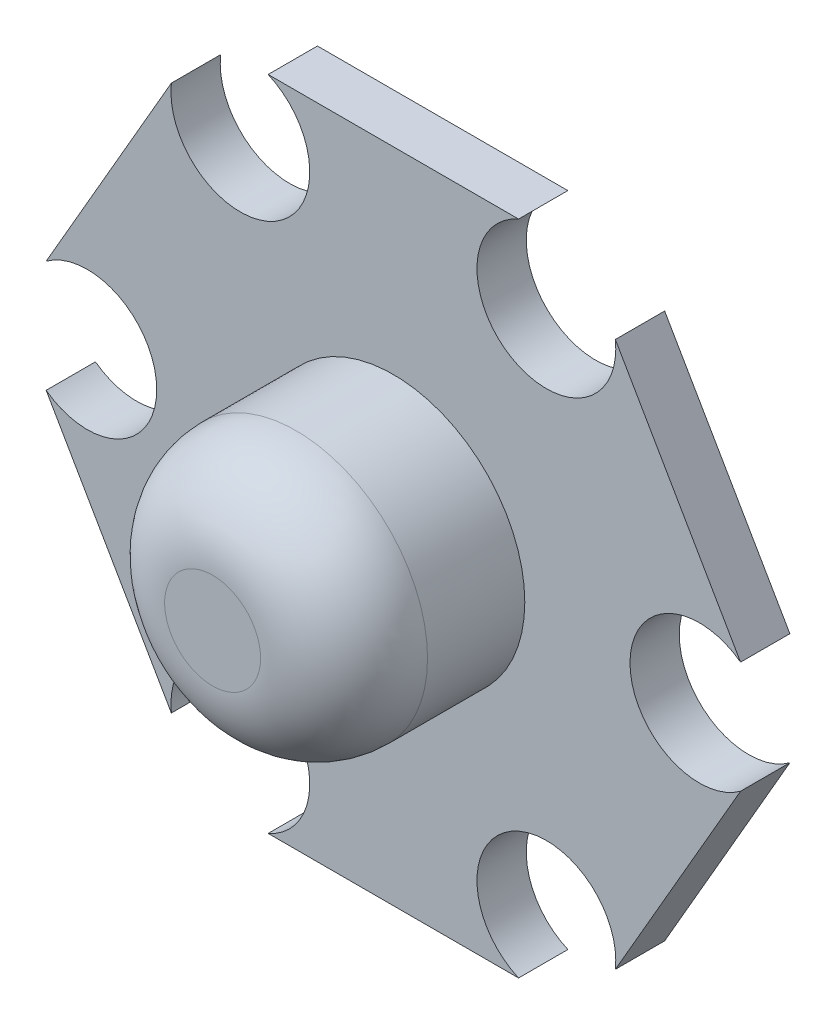
ISO-10303-21;
HEADER;
FILE_DESCRIPTION(('STEP AP214'),'2;1');
FILE_NAME('part.step','',(''),(''),'','','');
FILE_SCHEMA(('AUTOMOTIVE_DESIGN { 1 0 10303 214 1 1 1 1 }'));
ENDSEC;
DATA;
#1=APPLICATION_CONTEXT('core data for automotive mechanical design processes');
#2=APPLICATION_PROTOCOL_DEFINITION('international standard','automotive_design',2000,#1);
#3=PRODUCT_CONTEXT('',#1,'mechanical');
#4=PRODUCT('Part','Part','',(#3));
#5=PRODUCT_RELATED_PRODUCT_CATEGORY('part','',(#4));
#6=PRODUCT_DEFINITION_FORMATION('','',#4);
#7=PRODUCT_DEFINITION_CONTEXT('part definition',#1,'design');
#8=PRODUCT_DEFINITION('design','',#6,#7);
#9=PRODUCT_DEFINITION_SHAPE('','',#8);
#10=(LENGTH_UNIT() NAMED_UNIT(*) SI_UNIT(.MILLI.,.METRE.));
#11=(NAMED_UNIT(*) PLANE_ANGLE_UNIT() SI_UNIT($,.RADIAN.));
#12=(NAMED_UNIT(*) SI_UNIT($,.STERADIAN.) SOLID_ANGLE_UNIT());
#13=UNCERTAINTY_MEASURE_WITH_UNIT(LENGTH_MEASURE(1.E-05),#10,'distance_accuracy_value','');
#14=(GEOMETRIC_REPRESENTATION_CONTEXT(3) GLOBAL_UNCERTAINTY_ASSIGNED_CONTEXT((#13)) GLOBAL_UNIT_ASSIGNED_CONTEXT((#10,
#11,#12)) REPRESENTATION_CONTEXT('',''));
#15=CARTESIAN_POINT('',(0.,0.,0.));
#16=DIRECTION('',(0.,0.,1.));
#17=DIRECTION('',(1.,0.,0.));
#18=AXIS2_PLACEMENT_3D('',#15,#16,#17);
#19=CARTESIAN_POINT('',(-4.65611951543365,8.06463556684452,1.5));
#20=DIRECTION('',(0.,0.,-1.));
#21=DIRECTION('',(-1.,0.,0.));
#22=AXIS2_PLACEMENT_3D('',#19,#20,#21);
#23=CYLINDRICAL_SURFACE('',#22,2.11223903086769);
#24=CARTESIAN_POINT('',(-4.65611951543365,8.06463556684452,0.));
#25=DIRECTION('',(0.,0.,-1.));
#26=DIRECTION('',(1.,0.,0.));
#27=AXIS2_PLACEMENT_3D('',#24,#25,#26);
#28=CIRCLE('',#27,2.11223903086769);
#29=CARTESIAN_POINT('',(-3.81,10.,0.));
#30=VERTEX_POINT('',#29);
#31=CARTESIAN_POINT('',(-6.75525403784398,8.29955678841895,0.));
#32=VERTEX_POINT('',#31);
#33=EDGE_CURVE('E156',#30,#32,#28,.T.);
#34=ORIENTED_EDGE('',*,*,#33,.T.);
#35=DIRECTION('',(0.,0.,-1.));
#36=VECTOR('',#35,1.);
#37=CARTESIAN_POINT('',(-6.75525403784398,8.29955678841895,1.5));
#38=LINE('',#37,#36);
#39=CARTESIAN_POINT('',(-6.75525403784398,8.29955678841895,1.5));
#40=VERTEX_POINT('',#39);
#41=EDGE_CURVE('E204',#40,#32,#38,.T.);
#42=ORIENTED_EDGE('',*,*,#41,.F.);
#43=CARTESIAN_POINT('',(-4.65611951543365,8.06463556684452,1.5));
#44=DIRECTION('',(0.,0.,-1.));
#45=DIRECTION('',(1.,0.,0.));
#46=AXIS2_PLACEMENT_3D('',#43,#44,#45);
#47=CIRCLE('',#46,2.11223903086769);
#48=CARTESIAN_POINT('',(-3.81,10.,1.5));
#49=VERTEX_POINT('',#48);
#50=EDGE_CURVE('E179',#49,#40,#47,.T.);
#51=ORIENTED_EDGE('',*,*,#50,.F.);
#52=DIRECTION('',(0.,0.,-1.));
#53=VECTOR('',#52,1.);
#54=CARTESIAN_POINT('',(-3.81,10.,1.5));
#55=LINE('',#54,#53);
#56=EDGE_CURVE('E152',#49,#30,#55,.T.);
#57=ORIENTED_EDGE('',*,*,#56,.T.);
#58=EDGE_LOOP('',(#34,#42,#51,#57));
#59=FACE_BOUND('',#58,.T.);
#60=ADVANCED_FACE('F34',(#59),#23,.F.);
#61=CARTESIAN_POINT('',(-10.565254037844,1.70044321158152,1.5));
#62=DIRECTION('',(0.866025403784439,-0.499999999999999,0.));
#63=DIRECTION('',(0.499999999999999,0.866025403784439,0.));
#64=AXIS2_PLACEMENT_3D('',#61,#62,#63);
#65=PLANE('',#64);
#66=DIRECTION('',(-0.499999999999999,-0.866025403784439,0.));
#67=VECTOR('',#66,1.);
#68=CARTESIAN_POINT('',(-10.565254037844,1.70044321158152,0.));
#69=LINE('',#68,#67);
#70=CARTESIAN_POINT('',(-10.565254037844,1.70044321158152,0.));
#71=VERTEX_POINT('',#70);
#72=EDGE_CURVE('E159',#32,#71,#69,.T.);
#73=ORIENTED_EDGE('',*,*,#72,.T.);
#74=DIRECTION('',(0.,0.,-1.));
#75=VECTOR('',#74,1.);
#76=CARTESIAN_POINT('',(-10.565254037844,1.70044321158152,1.5));
#77=LINE('',#76,#75);
#78=CARTESIAN_POINT('',(-10.565254037844,1.70044321158152,1.5));
#79=VERTEX_POINT('',#78);
#80=EDGE_CURVE('E201',#79,#71,#77,.T.);
#81=ORIENTED_EDGE('',*,*,#80,.F.);
#82=DIRECTION('',(-0.499999999999999,-0.866025403784439,0.));
#83=VECTOR('',#82,1.);
#84=CARTESIAN_POINT('',(-10.565254037844,1.70044321158152,1.5));
#85=LINE('',#84,#83);
#86=EDGE_CURVE('E107',#40,#79,#85,.T.);
#87=ORIENTED_EDGE('',*,*,#86,.F.);
#88=ORIENTED_EDGE('',*,*,#41,.T.);
#89=EDGE_LOOP('',(#73,#81,#87,#88));
#90=FACE_BOUND('',#89,.T.);
#91=ADVANCED_FACE('F219',(#90),#65,.F.);
#92=CARTESIAN_POINT('',(-9.31223903086728,4.64689051127287E-13,1.5));
#93=DIRECTION('',(0.,0.,-1.));
#94=DIRECTION('',(-1.,0.,0.));
#95=AXIS2_PLACEMENT_3D('',#92,#93,#94);
#96=CYLINDRICAL_SURFACE('',#95,2.11223903086769);
#97=CARTESIAN_POINT('',(-9.31223903086728,4.64689051127287E-13,0.));
#98=DIRECTION('',(0.,0.,-1.));
#99=DIRECTION('',(1.,0.,0.));
#100=AXIS2_PLACEMENT_3D('',#97,#98,#99);
#101=CIRCLE('',#100,2.11223903086769);
#102=CARTESIAN_POINT('',(-10.565254037844,-1.70044321158059,0.));
#103=VERTEX_POINT('',#102);
#104=EDGE_CURVE('E162',#71,#103,#101,.T.);
#105=ORIENTED_EDGE('',*,*,#104,.T.);
#106=DIRECTION('',(0.,0.,-1.));
#107=VECTOR('',#106,1.);
#108=CARTESIAN_POINT('',(-10.565254037844,-1.70044321158059,1.5));
#109=LINE('',#108,#107);
#110=CARTESIAN_POINT('',(-10.565254037844,-1.70044321158059,1.5));
#111=VERTEX_POINT('',#110);
#112=EDGE_CURVE('E198',#111,#103,#109,.T.);
#113=ORIENTED_EDGE('',*,*,#112,.F.);
#114=CARTESIAN_POINT('',(-9.31223903086728,4.64689051127287E-13,1.5));
#115=DIRECTION('',(0.,0.,-1.));
#116=DIRECTION('',(1.,0.,0.));
#117=AXIS2_PLACEMENT_3D('',#114,#115,#116);
#118=CIRCLE('',#117,2.11223903086769);
#119=EDGE_CURVE('E279',#79,#111,#118,.T.);
#120=ORIENTED_EDGE('',*,*,#119,.F.);
#121=ORIENTED_EDGE('',*,*,#80,.T.);
#122=EDGE_LOOP('',(#105,#113,#120,#121));
#123=FACE_BOUND('',#122,.T.);
#124=ADVANCED_FACE('F224',(#123),#96,.F.);
#125=CARTESIAN_POINT('',(-6.75525403784398,-8.29955678841801,1.5));
#126=DIRECTION('',(0.866025403784438,0.5,0.));
#127=DIRECTION('',(-0.5,0.866025403784438,0.));
#128=AXIS2_PLACEMENT_3D('',#125,#126,#127);
#129=PLANE('',#128);
#130=DIRECTION('',(0.5,-0.866025403784438,0.));
#131=VECTOR('',#130,1.);
#132=CARTESIAN_POINT('',(-6.75525403784398,-8.29955678841801,0.));
#133=LINE('',#132,#131);
#134=CARTESIAN_POINT('',(-6.75525403784397,-8.29955678841801,0.));
#135=VERTEX_POINT('',#134);
#136=EDGE_CURVE('E164',#103,#135,#133,.T.);
#137=ORIENTED_EDGE('',*,*,#136,.T.);
#138=DIRECTION('',(0.,0.,-1.));
#139=VECTOR('',#138,1.);
#140=CARTESIAN_POINT('',(-6.75525403784397,-8.29955678841801,1.5));
#141=LINE('',#140,#139);
#142=CARTESIAN_POINT('',(-6.75525403784397,-8.29955678841801,1.5));
#143=VERTEX_POINT('',#142);
#144=EDGE_CURVE('E195',#143,#135,#141,.T.);
#145=ORIENTED_EDGE('',*,*,#144,.F.);
#146=DIRECTION('',(0.5,-0.866025403784438,0.));
#147=VECTOR('',#146,1.);
#148=CARTESIAN_POINT('',(-6.75525403784398,-8.29955678841801,1.5));
#149=LINE('',#148,#147);
#150=EDGE_CURVE('E281',#111,#143,#149,.T.);
#151=ORIENTED_EDGE('',*,*,#150,.F.);
#152=ORIENTED_EDGE('',*,*,#112,.T.);
#153=EDGE_LOOP('',(#137,#145,#151,#152));
#154=FACE_BOUND('',#153,.T.);
#155=ADVANCED_FACE('F229',(#154),#129,.F.);
#156=CARTESIAN_POINT('',(-4.65611951543364,-8.06463556684358,1.5));
#157=DIRECTION('',(0.,0.,-1.));
#158=DIRECTION('',(-1.,0.,0.));
#159=AXIS2_PLACEMENT_3D('',#156,#157,#158);
#160=CYLINDRICAL_SURFACE('',#159,2.11223903086769);
#161=CARTESIAN_POINT('',(-4.65611951543364,-8.06463556684358,0.));
#162=DIRECTION('',(0.,0.,-1.));
#163=DIRECTION('',(1.,0.,0.));
#164=AXIS2_PLACEMENT_3D('',#161,#162,#163);
#165=CIRCLE('',#164,2.11223903086769);
#166=CARTESIAN_POINT('',(-3.81,-9.99999999999906,0.));
#167=VERTEX_POINT('',#166);
#168=EDGE_CURVE('E166',#135,#167,#165,.T.);
#169=ORIENTED_EDGE('',*,*,#168,.T.);
#170=DIRECTION('',(0.,0.,-1.));
#171=VECTOR('',#170,1.);
#172=CARTESIAN_POINT('',(-3.81,-9.99999999999906,1.5));
#173=LINE('',#172,#171);
#174=CARTESIAN_POINT('',(-3.81,-9.99999999999906,1.5));
#175=VERTEX_POINT('',#174);
#176=EDGE_CURVE('E192',#175,#167,#173,.T.);
#177=ORIENTED_EDGE('',*,*,#176,.F.);
#178=CARTESIAN_POINT('',(-4.65611951543364,-8.06463556684358,1.5));
#179=DIRECTION('',(0.,0.,-1.));
#180=DIRECTION('',(1.,0.,0.));
#181=AXIS2_PLACEMENT_3D('',#178,#179,#180);
#182=CIRCLE('',#181,2.11223903086769);
#183=EDGE_CURVE('E283',#143,#175,#182,.T.);
#184=ORIENTED_EDGE('',*,*,#183,.F.);
#185=ORIENTED_EDGE('',*,*,#144,.T.);
#186=EDGE_LOOP('',(#169,#177,#184,#185));
#187=FACE_BOUND('',#186,.T.);
#188=ADVANCED_FACE('F233',(#187),#160,.F.);
#189=CARTESIAN_POINT('',(3.81,-9.99999999999906,1.5));
#190=DIRECTION('',(0.,1.,0.));
#191=DIRECTION('',(0.,0.,1.));
#192=AXIS2_PLACEMENT_3D('',#189,#190,#191);
#193=PLANE('',#192);
#194=DIRECTION('',(1.,0.,0.));
#195=VECTOR('',#194,1.);
#196=CARTESIAN_POINT('',(3.81,-9.99999999999906,0.));
#197=LINE('',#196,#195);
#198=CARTESIAN_POINT('',(3.81,-9.99999999999906,0.));
#199=VERTEX_POINT('',#198);
#200=EDGE_CURVE('E168',#167,#199,#197,.T.);
#201=ORIENTED_EDGE('',*,*,#200,.T.);
#202=DIRECTION('',(0.,0.,-1.));
#203=VECTOR('',#202,1.);
#204=CARTESIAN_POINT('',(3.81,-9.99999999999906,1.5));
#205=LINE('',#204,#203);
#206=CARTESIAN_POINT('',(3.81,-9.99999999999906,1.5));
#207=VERTEX_POINT('',#206);
#208=EDGE_CURVE('E189',#207,#199,#205,.T.);
#209=ORIENTED_EDGE('',*,*,#208,.F.);
#210=DIRECTION('',(1.,0.,0.));
#211=VECTOR('',#210,1.);
#212=CARTESIAN_POINT('',(3.81,-9.99999999999906,1.5));
#213=LINE('',#212,#211);
#214=EDGE_CURVE('E285',#175,#207,#213,.T.);
#215=ORIENTED_EDGE('',*,*,#214,.F.);
#216=ORIENTED_EDGE('',*,*,#176,.T.);
#217=EDGE_LOOP('',(#201,#209,#215,#216));
#218=FACE_BOUND('',#217,.T.);
#219=ADVANCED_FACE('F237',(#218),#193,.F.);
#220=CARTESIAN_POINT('',(4.65611951543364,-8.06463556684358,1.5));
#221=DIRECTION('',(0.,0.,-1.));
#222=DIRECTION('',(-1.,0.,0.));
#223=AXIS2_PLACEMENT_3D('',#220,#221,#222);
#224=CYLINDRICAL_SURFACE('',#223,2.11223903086769);
#225=CARTESIAN_POINT('',(4.65611951543364,-8.06463556684358,0.));
#226=DIRECTION('',(0.,0.,-1.));
#227=DIRECTION('',(1.,0.,0.));
#228=AXIS2_PLACEMENT_3D('',#225,#226,#227);
#229=CIRCLE('',#228,2.11223903086769);
#230=CARTESIAN_POINT('',(6.75525403784398,-8.29955678841801,0.));
#231=VERTEX_POINT('',#230);
#232=EDGE_CURVE('E170',#199,#231,#229,.T.);
#233=ORIENTED_EDGE('',*,*,#232,.T.);
#234=DIRECTION('',(0.,0.,-1.));
#235=VECTOR('',#234,1.);
#236=CARTESIAN_POINT('',(6.75525403784398,-8.29955678841801,1.5));
#237=LINE('',#236,#235);
#238=CARTESIAN_POINT('',(6.75525403784398,-8.29955678841801,1.5));
#239=VERTEX_POINT('',#238);
#240=EDGE_CURVE('E186',#239,#231,#237,.T.);
#241=ORIENTED_EDGE('',*,*,#240,.F.);
#242=CARTESIAN_POINT('',(4.65611951543364,-8.06463556684358,1.5));
#243=DIRECTION('',(0.,0.,-1.));
#244=DIRECTION('',(1.,0.,0.));
#245=AXIS2_PLACEMENT_3D('',#242,#243,#244);
#246=CIRCLE('',#245,2.11223903086769);
#247=EDGE_CURVE('E287',#207,#239,#246,.T.);
#248=ORIENTED_EDGE('',*,*,#247,.F.);
#249=ORIENTED_EDGE('',*,*,#208,.T.);
#250=EDGE_LOOP('',(#233,#241,#248,#249));
#251=FACE_BOUND('',#250,.T.);
#252=ADVANCED_FACE('F241',(#251),#224,.F.);
#253=CARTESIAN_POINT('',(10.565254037844,-1.70044321158058,1.5));
#254=DIRECTION('',(-0.866025403784439,0.5,0.));
#255=DIRECTION('',(-0.5,-0.866025403784439,0.));
#256=AXIS2_PLACEMENT_3D('',#253,#254,#255);
#257=PLANE('',#256);
#258=DIRECTION('',(0.5,0.866025403784439,0.));
#259=VECTOR('',#258,1.);
#260=CARTESIAN_POINT('',(10.565254037844,-1.70044321158058,0.));
#261=LINE('',#260,#259);
#262=CARTESIAN_POINT('',(10.565254037844,-1.70044321158058,0.));
#263=VERTEX_POINT('',#262);
#264=EDGE_CURVE('E172',#231,#263,#261,.T.);
#265=ORIENTED_EDGE('',*,*,#264,.T.);
#266=DIRECTION('',(0.,0.,-1.));
#267=VECTOR('',#266,1.);
#268=CARTESIAN_POINT('',(10.565254037844,-1.70044321158058,1.5));
#269=LINE('',#268,#267);
#270=CARTESIAN_POINT('',(10.565254037844,-1.70044321158058,1.5));
#271=VERTEX_POINT('',#270);
#272=EDGE_CURVE('E183',#271,#263,#269,.T.);
#273=ORIENTED_EDGE('',*,*,#272,.F.);
#274=DIRECTION('',(0.5,0.866025403784439,0.));
#275=VECTOR('',#274,1.);
#276=CARTESIAN_POINT('',(10.565254037844,-1.70044321158058,1.5));
#277=LINE('',#276,#275);
#278=EDGE_CURVE('E289',#239,#271,#277,.T.);
#279=ORIENTED_EDGE('',*,*,#278,.F.);
#280=ORIENTED_EDGE('',*,*,#240,.T.);
#281=EDGE_LOOP('',(#265,#273,#279,#280));
#282=FACE_BOUND('',#281,.T.);
#283=ADVANCED_FACE('F245',(#282),#257,.F.);
#284=CARTESIAN_POINT('',(9.31223903086729,4.72278466334686E-13,1.5));
#285=DIRECTION('',(0.,0.,-1.));
#286=DIRECTION('',(-1.,0.,0.));
#287=AXIS2_PLACEMENT_3D('',#284,#285,#286);
#288=CYLINDRICAL_SURFACE('',#287,2.11223903086769);
#289=CARTESIAN_POINT('',(9.31223903086729,4.72278466334686E-13,0.));
#290=DIRECTION('',(0.,0.,-1.));
#291=DIRECTION('',(1.,0.,0.));
#292=AXIS2_PLACEMENT_3D('',#289,#290,#291);
#293=CIRCLE('',#292,2.11223903086769);
#294=CARTESIAN_POINT('',(10.565254037844,1.70044321158153,0.));
#295=VERTEX_POINT('',#294);
#296=EDGE_CURVE('E174',#263,#295,#293,.T.);
#297=ORIENTED_EDGE('',*,*,#296,.T.);
#298=DIRECTION('',(0.,0.,-1.));
#299=VECTOR('',#298,1.);
#300=CARTESIAN_POINT('',(10.565254037844,1.70044321158153,1.5));
#301=LINE('',#300,#299);
#302=CARTESIAN_POINT('',(10.565254037844,1.70044321158153,1.5));
#303=VERTEX_POINT('',#302);
#304=EDGE_CURVE('E147',#303,#295,#301,.T.);
#305=ORIENTED_EDGE('',*,*,#304,.F.);
#306=CARTESIAN_POINT('',(9.31223903086729,4.72278466334686E-13,1.5));
#307=DIRECTION('',(0.,0.,-1.));
#308=DIRECTION('',(1.,0.,0.));
#309=AXIS2_PLACEMENT_3D('',#306,#307,#308);
#310=CIRCLE('',#309,2.11223903086769);
#311=EDGE_CURVE('E138',#271,#303,#310,.T.);
#312=ORIENTED_EDGE('',*,*,#311,.F.);
#313=ORIENTED_EDGE('',*,*,#272,.T.);
#314=EDGE_LOOP('',(#297,#305,#312,#313));
#315=FACE_BOUND('',#314,.T.);
#316=ADVANCED_FACE('F249',(#315),#288,.F.);
#317=CARTESIAN_POINT('',(6.75525403784398,8.29955678841895,1.5));
#318=DIRECTION('',(-0.866025403784438,-0.5,0.));
#319=DIRECTION('',(0.5,-0.866025403784439,0.));
#320=AXIS2_PLACEMENT_3D('',#317,#318,#319);
#321=PLANE('',#320);
#322=DIRECTION('',(-0.5,0.866025403784439,0.));
#323=VECTOR('',#322,1.);
#324=CARTESIAN_POINT('',(6.75525403784398,8.29955678841895,0.));
#325=LINE('',#324,#323);
#326=CARTESIAN_POINT('',(6.75525403784398,8.29955678841895,0.));
#327=VERTEX_POINT('',#326);
#328=EDGE_CURVE('E146',#295,#327,#325,.T.);
#329=ORIENTED_EDGE('',*,*,#328,.T.);
#330=DIRECTION('',(0.,0.,-1.));
#331=VECTOR('',#330,1.);
#332=CARTESIAN_POINT('',(6.75525403784398,8.29955678841895,1.5));
#333=LINE('',#332,#331);
#334=CARTESIAN_POINT('',(6.75525403784398,8.29955678841895,1.5));
#335=VERTEX_POINT('',#334);
#336=EDGE_CURVE('E143',#335,#327,#333,.T.);
#337=ORIENTED_EDGE('',*,*,#336,.F.);
#338=DIRECTION('',(-0.5,0.866025403784439,0.));
#339=VECTOR('',#338,1.);
#340=CARTESIAN_POINT('',(6.75525403784398,8.29955678841895,1.5));
#341=LINE('',#340,#339);
#342=EDGE_CURVE('E132',#303,#335,#341,.T.);
#343=ORIENTED_EDGE('',*,*,#342,.F.);
#344=ORIENTED_EDGE('',*,*,#304,.T.);
#345=EDGE_LOOP('',(#329,#337,#343,#344));
#346=FACE_BOUND('',#345,.T.);
#347=ADVANCED_FACE('F144',(#346),#321,.F.);
#348=CARTESIAN_POINT('',(4.65611951543364,8.06463556684452,1.5));
#349=DIRECTION('',(0.,0.,-1.));
#350=DIRECTION('',(-1.,0.,0.));
#351=AXIS2_PLACEMENT_3D('',#348,#349,#350);
#352=CYLINDRICAL_SURFACE('',#351,2.11223903086769);
#353=CARTESIAN_POINT('',(4.65611951543364,8.06463556684452,0.));
#354=DIRECTION('',(0.,0.,-1.));
#355=DIRECTION('',(1.,0.,0.));
#356=AXIS2_PLACEMENT_3D('',#353,#354,#355);
#357=CIRCLE('',#356,2.11223903086769);
#358=CARTESIAN_POINT('',(3.81,10.,0.));
#359=VERTEX_POINT('',#358);
#360=EDGE_CURVE('E92',#327,#359,#357,.T.);
#361=ORIENTED_EDGE('',*,*,#360,.T.);
#362=DIRECTION('',(0.,0.,-1.));
#363=VECTOR('',#362,1.);
#364=CARTESIAN_POINT('',(3.81,10.,1.5));
#365=LINE('',#364,#363);
#366=CARTESIAN_POINT('',(3.81,10.,1.5));
#367=VERTEX_POINT('',#366);
#368=EDGE_CURVE('E148',#367,#359,#365,.T.);
#369=ORIENTED_EDGE('',*,*,#368,.F.);
#370=CARTESIAN_POINT('',(4.65611951543364,8.06463556684452,1.5));
#371=DIRECTION('',(0.,0.,-1.));
#372=DIRECTION('',(1.,0.,0.));
#373=AXIS2_PLACEMENT_3D('',#370,#371,#372);
#374=CIRCLE('',#373,2.11223903086769);
#375=EDGE_CURVE('E136',#335,#367,#374,.T.);
#376=ORIENTED_EDGE('',*,*,#375,.F.);
#377=ORIENTED_EDGE('',*,*,#336,.T.);
#378=EDGE_LOOP('',(#361,#369,#376,#377));
#379=FACE_BOUND('',#378,.T.);
#380=ADVANCED_FACE('F150',(#379),#352,.F.);
#381=CARTESIAN_POINT('',(-3.81,10.,1.5));
#382=DIRECTION('',(0.,-1.,0.));
#383=DIRECTION('',(0.,0.,-1.));
#384=AXIS2_PLACEMENT_3D('',#381,#382,#383);
#385=PLANE('',#384);
#386=DIRECTION('',(-1.,0.,0.));
#387=VECTOR('',#386,1.);
#388=CARTESIAN_POINT('',(-3.81,10.,0.));
#389=LINE('',#388,#387);
#390=EDGE_CURVE('E98',#359,#30,#389,.T.);
#391=ORIENTED_EDGE('',*,*,#390,.T.);
#392=ORIENTED_EDGE('',*,*,#56,.F.);
#393=DIRECTION('',(-1.,0.,0.));
#394=VECTOR('',#393,1.);
#395=CARTESIAN_POINT('',(-3.81,10.,1.5));
#396=LINE('',#395,#394);
#397=EDGE_CURVE('E51',#367,#49,#396,.T.);
#398=ORIENTED_EDGE('',*,*,#397,.F.);
#399=ORIENTED_EDGE('',*,*,#368,.T.);
#400=EDGE_LOOP('',(#391,#392,#398,#399));
#401=FACE_BOUND('',#400,.T.);
#402=ADVANCED_FACE('F258',(#401),#385,.F.);
#403=CARTESIAN_POINT('',(-4.65611951543365,8.06463556684452,1.5));
#404=DIRECTION('',(0.,0.,1.));
#405=DIRECTION('',(1.,0.,0.));
#406=AXIS2_PLACEMENT_3D('',#403,#404,#405);
#407=PLANE('',#406);
#408=CARTESIAN_POINT('',(0.,0.,1.5));
#409=DIRECTION('',(0.,0.,1.));
#410=DIRECTION('',(1.,0.,0.));
#411=AXIS2_PLACEMENT_3D('',#408,#409,#410);
#412=CIRCLE('',#411,4.);
#413=CARTESIAN_POINT('',(4.,0.,1.5));
#414=VERTEX_POINT('',#413);
#415=EDGE_CURVE('E160',#414,#414,#412,.T.);
#416=ORIENTED_EDGE('',*,*,#415,.F.);
#417=EDGE_LOOP('',(#416));
#418=FACE_BOUND('',#417,.T.);
#419=ORIENTED_EDGE('',*,*,#50,.T.);
#420=ORIENTED_EDGE('',*,*,#86,.T.);
#421=ORIENTED_EDGE('',*,*,#119,.T.);
#422=ORIENTED_EDGE('',*,*,#150,.T.);
#423=ORIENTED_EDGE('',*,*,#183,.T.);
#424=ORIENTED_EDGE('',*,*,#214,.T.);
#425=ORIENTED_EDGE('',*,*,#247,.T.);
#426=ORIENTED_EDGE('',*,*,#278,.T.);
#427=ORIENTED_EDGE('',*,*,#311,.T.);
#428=ORIENTED_EDGE('',*,*,#342,.T.);
#429=ORIENTED_EDGE('',*,*,#375,.T.);
#430=ORIENTED_EDGE('',*,*,#397,.T.);
#431=EDGE_LOOP('',(#419,#420,#421,#422,#423,#424,#425,#426,#427,#428,#429,#430));
#432=FACE_BOUND('',#431,.T.);
#433=ADVANCED_FACE('F134',(#418,#432),#407,.T.);
#434=CARTESIAN_POINT('',(-4.65611951543365,8.06463556684452,0.));
#435=DIRECTION('',(0.,0.,1.));
#436=DIRECTION('',(1.,0.,0.));
#437=AXIS2_PLACEMENT_3D('',#434,#435,#436);
#438=PLANE('',#437);
#439=ORIENTED_EDGE('',*,*,#33,.F.);
#440=ORIENTED_EDGE('',*,*,#390,.F.);
#441=ORIENTED_EDGE('',*,*,#360,.F.);
#442=ORIENTED_EDGE('',*,*,#328,.F.);
#443=ORIENTED_EDGE('',*,*,#296,.F.);
#444=ORIENTED_EDGE('',*,*,#264,.F.);
#445=ORIENTED_EDGE('',*,*,#232,.F.);
#446=ORIENTED_EDGE('',*,*,#200,.F.);
#447=ORIENTED_EDGE('',*,*,#168,.F.);
#448=ORIENTED_EDGE('',*,*,#136,.F.);
#449=ORIENTED_EDGE('',*,*,#104,.F.);
#450=ORIENTED_EDGE('',*,*,#72,.F.);
#451=EDGE_LOOP('',(#439,#440,#441,#442,#443,#444,#445,#446,#447,#448,#449,#450));
#452=FACE_BOUND('',#451,.T.);
#453=ADVANCED_FACE('F261',(#452),#438,.F.);
#454=CARTESIAN_POINT('',(0.,0.,7.));
#455=DIRECTION('',(0.,0.,-1.));
#456=DIRECTION('',(-1.,0.,0.));
#457=AXIS2_PLACEMENT_3D('',#454,#455,#456);
#458=CYLINDRICAL_SURFACE('',#457,4.);
#459=CARTESIAN_POINT('',(0.,0.,4.46));
#460=DIRECTION('',(0.,0.,1.));
#461=DIRECTION('',(1.,0.,0.));
#462=AXIS2_PLACEMENT_3D('',#459,#460,#461);
#463=CIRCLE('',#462,4.);
#464=CARTESIAN_POINT('',(4.,0.,4.46));
#465=VERTEX_POINT('',#464);
#466=EDGE_CURVE('E11',#465,#465,#463,.F.);
#467=ORIENTED_EDGE('',*,*,#466,.T.);
#468=EDGE_LOOP('',(#467));
#469=FACE_BOUND('',#468,.T.);
#470=ORIENTED_EDGE('',*,*,#415,.T.);
#471=EDGE_LOOP('',(#470));
#472=FACE_BOUND('',#471,.T.);
#473=ADVANCED_FACE('F215',(#469,#472),#458,.T.);
#474=CARTESIAN_POINT('',(0.,0.,7.));
#475=DIRECTION('',(0.,0.,1.));
#476=DIRECTION('',(1.,0.,0.));
#477=AXIS2_PLACEMENT_3D('',#474,#475,#476);
#478=PLANE('',#477);
#479=CARTESIAN_POINT('',(0.,0.,7.));
#480=DIRECTION('',(0.,0.,1.));
#481=DIRECTION('',(1.,0.,0.));
#482=AXIS2_PLACEMENT_3D('',#479,#480,#481);
#483=CIRCLE('',#482,1.46);
#484=CARTESIAN_POINT('',(1.46,0.,7.));
#485=VERTEX_POINT('',#484);
#486=EDGE_CURVE('E43',#485,#485,#483,.T.);
#487=ORIENTED_EDGE('',*,*,#486,.T.);
#488=EDGE_LOOP('',(#487));
#489=FACE_BOUND('',#488,.T.);
#490=ADVANCED_FACE('F208',(#489),#478,.T.);
#491=CARTESIAN_POINT('',(0.,0.,4.46));
#492=DIRECTION('',(0.,0.,1.));
#493=DIRECTION('',(1.,0.,0.));
#494=AXIS2_PLACEMENT_3D('',#491,#492,#493);
#495=DEGENERATE_TOROIDAL_SURFACE('',#494,1.46,2.54,.T.);
#496=ORIENTED_EDGE('',*,*,#466,.F.);
#497=EDGE_LOOP('',(#496));
#498=FACE_BOUND('',#497,.T.);
#499=ORIENTED_EDGE('',*,*,#486,.F.);
#500=EDGE_LOOP('',(#499));
#501=FACE_BOUND('',#500,.T.);
#502=ADVANCED_FACE('F36',(#498,#501),#495,.T.);
#503=CLOSED_SHELL('',(#60,#91,#124,#155,#188,#219,#252,#283,#316,#347,#380,#402,#433,#453,#473,
#490,#502));
#504=MANIFOLD_SOLID_BREP('B2',#503);
#505=ADVANCED_BREP_SHAPE_REPRESENTATION('',(#18,#504),#14);
#506=SHAPE_DEFINITION_REPRESENTATION(#9,#505);
ENDSEC;
END-ISO-10303-21;
